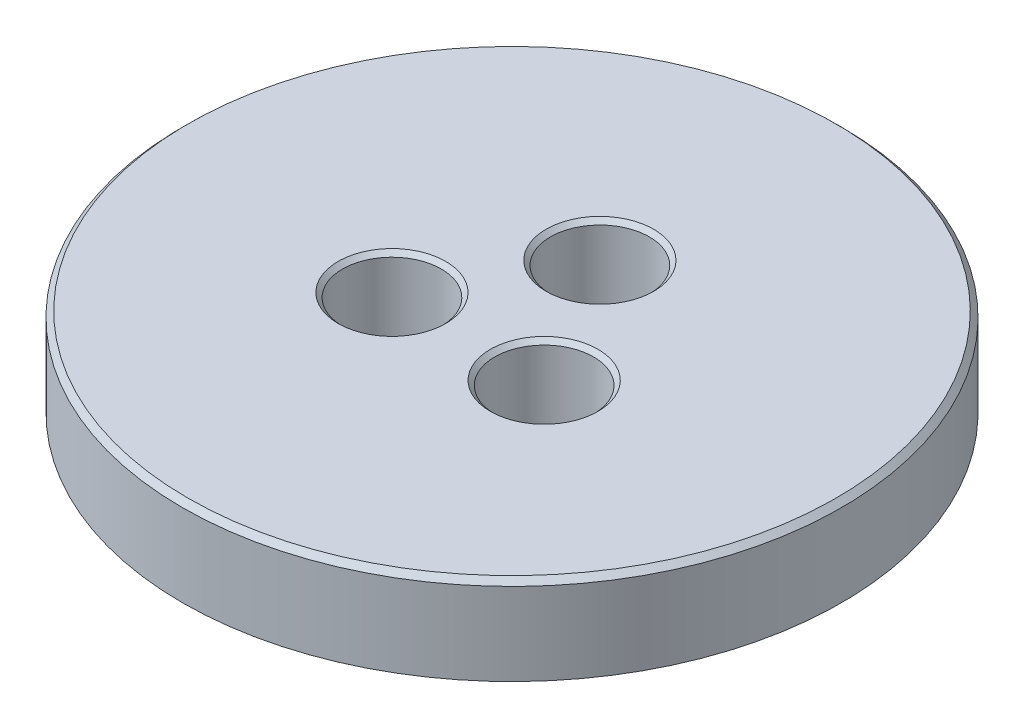
ISO-10303-21;
HEADER;
FILE_DESCRIPTION(('STEP AP214'),'2;1');
FILE_NAME('part.step','',(''),(''),'','','');
FILE_SCHEMA(('AUTOMOTIVE_DESIGN { 1 0 10303 214 1 1 1 1 }'));
ENDSEC;
DATA;
#1=APPLICATION_CONTEXT('core data for automotive mechanical design processes');
#2=APPLICATION_PROTOCOL_DEFINITION('international standard','automotive_design',2000,#1);
#3=PRODUCT_CONTEXT('',#1,'mechanical');
#4=PRODUCT('Part','Part','',(#3));
#5=PRODUCT_RELATED_PRODUCT_CATEGORY('part','',(#4));
#6=PRODUCT_DEFINITION_FORMATION('','',#4);
#7=PRODUCT_DEFINITION_CONTEXT('part definition',#1,'design');
#8=PRODUCT_DEFINITION('design','',#6,#7);
#9=PRODUCT_DEFINITION_SHAPE('','',#8);
#10=(LENGTH_UNIT() NAMED_UNIT(*) SI_UNIT(.MILLI.,.METRE.));
#11=(NAMED_UNIT(*) PLANE_ANGLE_UNIT() SI_UNIT($,.RADIAN.));
#12=(NAMED_UNIT(*) SI_UNIT($,.STERADIAN.) SOLID_ANGLE_UNIT());
#13=UNCERTAINTY_MEASURE_WITH_UNIT(LENGTH_MEASURE(1.E-05),#10,'distance_accuracy_value','');
#14=(GEOMETRIC_REPRESENTATION_CONTEXT(3) GLOBAL_UNCERTAINTY_ASSIGNED_CONTEXT((#13)) GLOBAL_UNIT_ASSIGNED_CONTEXT((#10,
#11,#12)) REPRESENTATION_CONTEXT('',''));
#15=CARTESIAN_POINT('',(0.,0.,0.));
#16=DIRECTION('',(0.,0.,1.));
#17=DIRECTION('',(1.,0.,0.));
#18=AXIS2_PLACEMENT_3D('',#15,#16,#17);
#19=CARTESIAN_POINT('',(0.,2.,0.));
#20=DIRECTION('',(0.,1.,0.));
#21=DIRECTION('',(0.,0.,1.));
#22=AXIS2_PLACEMENT_3D('',#19,#20,#21);
#23=PLANE('',#22);
#24=CARTESIAN_POINT('',(0.,2.,0.));
#25=DIRECTION('',(0.,1.,0.));
#26=DIRECTION('',(0.,0.,1.));
#27=AXIS2_PLACEMENT_3D('',#24,#25,#26);
#28=CIRCLE('',#27,7.375);
#29=CARTESIAN_POINT('',(0.,2.,7.375));
#30=VERTEX_POINT('',#29);
#31=EDGE_CURVE('E10',#30,#30,#28,.T.);
#32=ORIENTED_EDGE('',*,*,#31,.T.);
#33=EDGE_LOOP('',(#32));
#34=FACE_BOUND('',#33,.T.);
#35=CARTESIAN_POINT('',(1.73205080756888,2.,0.999999999999998));
#36=DIRECTION('',(0.,1.,0.));
#37=DIRECTION('',(0.,0.,1.));
#38=AXIS2_PLACEMENT_3D('',#35,#36,#37);
#39=CIRCLE('',#38,1.22500000000001);
#40=CARTESIAN_POINT('',(1.73205080756888,2.,2.225));
#41=VERTEX_POINT('',#40);
#42=EDGE_CURVE('E61',#41,#41,#39,.F.);
#43=ORIENTED_EDGE('',*,*,#42,.T.);
#44=EDGE_LOOP('',(#43));
#45=FACE_BOUND('',#44,.T.);
#46=CARTESIAN_POINT('',(-1.73205080756888,2.,0.999999999999996));
#47=DIRECTION('',(0.,1.,0.));
#48=DIRECTION('',(0.,0.,1.));
#49=AXIS2_PLACEMENT_3D('',#46,#47,#48);
#50=CIRCLE('',#49,1.22500000000001);
#51=CARTESIAN_POINT('',(-1.73205080756888,2.,2.225));
#52=VERTEX_POINT('',#51);
#53=EDGE_CURVE('E65',#52,#52,#50,.F.);
#54=ORIENTED_EDGE('',*,*,#53,.T.);
#55=EDGE_LOOP('',(#54));
#56=FACE_BOUND('',#55,.T.);
#57=CARTESIAN_POINT('',(0.,2.,-2.));
#58=DIRECTION('',(0.,1.,0.));
#59=DIRECTION('',(0.,0.,1.));
#60=AXIS2_PLACEMENT_3D('',#57,#58,#59);
#61=CIRCLE('',#60,1.22500000000001);
#62=CARTESIAN_POINT('',(0.,2.,-0.774999999999994));
#63=VERTEX_POINT('',#62);
#64=EDGE_CURVE('E68',#63,#63,#61,.F.);
#65=ORIENTED_EDGE('',*,*,#64,.T.);
#66=EDGE_LOOP('',(#65));
#67=FACE_BOUND('',#66,.T.);
#68=ADVANCED_FACE('F39',(#34,#45,#56,#67),#23,.T.);
#69=CARTESIAN_POINT('',(0.,0.,0.));
#70=DIRECTION('',(0.,-1.,0.));
#71=DIRECTION('',(0.,0.,-1.));
#72=AXIS2_PLACEMENT_3D('',#69,#70,#71);
#73=CYLINDRICAL_SURFACE('',#72,7.5);
#74=CARTESIAN_POINT('',(0.,1.875,0.));
#75=DIRECTION('',(0.,1.,0.));
#76=DIRECTION('',(0.,0.,1.));
#77=AXIS2_PLACEMENT_3D('',#74,#75,#76);
#78=CIRCLE('',#77,7.5);
#79=CARTESIAN_POINT('',(0.,1.875,7.5));
#80=VERTEX_POINT('',#79);
#81=EDGE_CURVE('E47',#80,#80,#78,.F.);
#82=ORIENTED_EDGE('',*,*,#81,.T.);
#83=EDGE_LOOP('',(#82));
#84=FACE_BOUND('',#83,.T.);
#85=CARTESIAN_POINT('',(0.,0.,0.));
#86=DIRECTION('',(0.,-1.,0.));
#87=DIRECTION('',(0.,0.,-1.));
#88=AXIS2_PLACEMENT_3D('',#85,#86,#87);
#89=CIRCLE('',#88,7.5);
#90=CARTESIAN_POINT('',(0.,0.,-7.5));
#91=VERTEX_POINT('',#90);
#92=EDGE_CURVE('E75',#91,#91,#89,.T.);
#93=ORIENTED_EDGE('',*,*,#92,.F.);
#94=EDGE_LOOP('',(#93));
#95=FACE_BOUND('',#94,.T.);
#96=ADVANCED_FACE('F109',(#84,#95),#73,.T.);
#97=CARTESIAN_POINT('',(0.,0.,0.));
#98=DIRECTION('',(0.,-1.,0.));
#99=DIRECTION('',(0.,0.,-1.));
#100=AXIS2_PLACEMENT_3D('',#97,#98,#99);
#101=PLANE('',#100);
#102=CARTESIAN_POINT('',(0.,0.,-2.));
#103=DIRECTION('',(0.,1.,0.));
#104=DIRECTION('',(0.,0.,1.));
#105=AXIS2_PLACEMENT_3D('',#102,#103,#104);
#106=CIRCLE('',#105,1.125);
#107=CARTESIAN_POINT('',(0.,0.,-0.875));
#108=VERTEX_POINT('',#107);
#109=EDGE_CURVE('E78',#108,#108,#106,.T.);
#110=ORIENTED_EDGE('',*,*,#109,.T.);
#111=EDGE_LOOP('',(#110));
#112=FACE_BOUND('',#111,.T.);
#113=CARTESIAN_POINT('',(-1.73205080756888,0.,0.999999999999996));
#114=DIRECTION('',(0.,1.,0.));
#115=DIRECTION('',(0.,0.,1.));
#116=AXIS2_PLACEMENT_3D('',#113,#114,#115);
#117=CIRCLE('',#116,1.125);
#118=CARTESIAN_POINT('',(-1.73205080756888,0.,2.125));
#119=VERTEX_POINT('',#118);
#120=EDGE_CURVE('E82',#119,#119,#117,.T.);
#121=ORIENTED_EDGE('',*,*,#120,.T.);
#122=EDGE_LOOP('',(#121));
#123=FACE_BOUND('',#122,.T.);
#124=CARTESIAN_POINT('',(1.73205080756888,0.,0.999999999999998));
#125=DIRECTION('',(0.,1.,0.));
#126=DIRECTION('',(0.,0.,1.));
#127=AXIS2_PLACEMENT_3D('',#124,#125,#126);
#128=CIRCLE('',#127,1.125);
#129=CARTESIAN_POINT('',(1.73205080756888,0.,2.125));
#130=VERTEX_POINT('',#129);
#131=EDGE_CURVE('E79',#130,#130,#128,.T.);
#132=ORIENTED_EDGE('',*,*,#131,.T.);
#133=EDGE_LOOP('',(#132));
#134=FACE_BOUND('',#133,.T.);
#135=ORIENTED_EDGE('',*,*,#92,.T.);
#136=EDGE_LOOP('',(#135));
#137=FACE_BOUND('',#136,.T.);
#138=ADVANCED_FACE('F89',(#112,#123,#134,#137),#101,.T.);
#139=CARTESIAN_POINT('',(1.73205080756888,2.,0.999999999999998));
#140=DIRECTION('',(0.,-1.,0.));
#141=DIRECTION('',(0.,0.,-1.));
#142=AXIS2_PLACEMENT_3D('',#139,#140,#141);
#143=CYLINDRICAL_SURFACE('',#142,1.125);
#144=CARTESIAN_POINT('',(1.73205080756888,1.9,0.999999999999998));
#145=DIRECTION('',(0.,1.,0.));
#146=DIRECTION('',(0.,0.,1.));
#147=AXIS2_PLACEMENT_3D('',#144,#145,#146);
#148=CIRCLE('',#147,1.125);
#149=CARTESIAN_POINT('',(1.73205080756888,1.9,2.125));
#150=VERTEX_POINT('',#149);
#151=EDGE_CURVE('E72',#150,#150,#148,.T.);
#152=ORIENTED_EDGE('',*,*,#151,.T.);
#153=EDGE_LOOP('',(#152));
#154=FACE_BOUND('',#153,.T.);
#155=ORIENTED_EDGE('',*,*,#131,.F.);
#156=EDGE_LOOP('',(#155));
#157=FACE_BOUND('',#156,.T.);
#158=ADVANCED_FACE('F105',(#154,#157),#143,.F.);
#159=CARTESIAN_POINT('',(-1.73205080756888,2.,0.999999999999996));
#160=DIRECTION('',(0.,-1.,0.));
#161=DIRECTION('',(0.,0.,-1.));
#162=AXIS2_PLACEMENT_3D('',#159,#160,#161);
#163=CYLINDRICAL_SURFACE('',#162,1.125);
#164=CARTESIAN_POINT('',(-1.73205080756888,1.9,0.999999999999996));
#165=DIRECTION('',(0.,1.,0.));
#166=DIRECTION('',(0.,0.,1.));
#167=AXIS2_PLACEMENT_3D('',#164,#165,#166);
#168=CIRCLE('',#167,1.125);
#169=CARTESIAN_POINT('',(-1.73205080756888,1.9,2.125));
#170=VERTEX_POINT('',#169);
#171=EDGE_CURVE('E56',#170,#170,#168,.T.);
#172=ORIENTED_EDGE('',*,*,#171,.T.);
#173=EDGE_LOOP('',(#172));
#174=FACE_BOUND('',#173,.T.);
#175=ORIENTED_EDGE('',*,*,#120,.F.);
#176=EDGE_LOOP('',(#175));
#177=FACE_BOUND('',#176,.T.);
#178=ADVANCED_FACE('F95',(#174,#177),#163,.F.);
#179=CARTESIAN_POINT('',(0.,2.,-2.));
#180=DIRECTION('',(0.,-1.,0.));
#181=DIRECTION('',(0.,0.,-1.));
#182=AXIS2_PLACEMENT_3D('',#179,#180,#181);
#183=CYLINDRICAL_SURFACE('',#182,1.125);
#184=CARTESIAN_POINT('',(0.,1.9,-2.));
#185=DIRECTION('',(0.,1.,0.));
#186=DIRECTION('',(0.,0.,1.));
#187=AXIS2_PLACEMENT_3D('',#184,#185,#186);
#188=CIRCLE('',#187,1.125);
#189=CARTESIAN_POINT('',(0.,1.9,-0.875));
#190=VERTEX_POINT('',#189);
#191=EDGE_CURVE('E51',#190,#190,#188,.T.);
#192=ORIENTED_EDGE('',*,*,#191,.T.);
#193=EDGE_LOOP('',(#192));
#194=FACE_BOUND('',#193,.T.);
#195=ORIENTED_EDGE('',*,*,#109,.F.);
#196=EDGE_LOOP('',(#195));
#197=FACE_BOUND('',#196,.T.);
#198=ADVANCED_FACE('F92',(#194,#197),#183,.F.);
#199=CARTESIAN_POINT('',(1.73205080756888,1.9,0.999999999999998));
#200=DIRECTION('',(0.,1.,0.));
#201=DIRECTION('',(0.,0.,1.));
#202=AXIS2_PLACEMENT_3D('',#199,#200,#201);
#203=CONICAL_SURFACE('',#202,1.125,0.785398163397461);
#204=ORIENTED_EDGE('',*,*,#42,.F.);
#205=EDGE_LOOP('',(#204));
#206=FACE_BOUND('',#205,.T.);
#207=ORIENTED_EDGE('',*,*,#151,.F.);
#208=EDGE_LOOP('',(#207));
#209=FACE_BOUND('',#208,.T.);
#210=ADVANCED_FACE('F94',(#206,#209),#203,.F.);
#211=CARTESIAN_POINT('',(-1.73205080756888,1.9,0.999999999999996));
#212=DIRECTION('',(0.,1.,0.));
#213=DIRECTION('',(0.,0.,1.));
#214=AXIS2_PLACEMENT_3D('',#211,#212,#213);
#215=CONICAL_SURFACE('',#214,1.125,0.785398163397461);
#216=ORIENTED_EDGE('',*,*,#53,.F.);
#217=EDGE_LOOP('',(#216));
#218=FACE_BOUND('',#217,.T.);
#219=ORIENTED_EDGE('',*,*,#171,.F.);
#220=EDGE_LOOP('',(#219));
#221=FACE_BOUND('',#220,.T.);
#222=ADVANCED_FACE('F102',(#218,#221),#215,.F.);
#223=CARTESIAN_POINT('',(0.,1.9,-2.));
#224=DIRECTION('',(0.,1.,0.));
#225=DIRECTION('',(0.,0.,1.));
#226=AXIS2_PLACEMENT_3D('',#223,#224,#225);
#227=CONICAL_SURFACE('',#226,1.125,0.785398163397461);
#228=ORIENTED_EDGE('',*,*,#64,.F.);
#229=EDGE_LOOP('',(#228));
#230=FACE_BOUND('',#229,.T.);
#231=ORIENTED_EDGE('',*,*,#191,.F.);
#232=EDGE_LOOP('',(#231));
#233=FACE_BOUND('',#232,.T.);
#234=ADVANCED_FACE('F126',(#230,#233),#227,.F.);
#235=CARTESIAN_POINT('',(0.,1.875,0.));
#236=DIRECTION('',(0.,-1.,0.));
#237=DIRECTION('',(0.,0.,-1.));
#238=AXIS2_PLACEMENT_3D('',#235,#236,#237);
#239=CONICAL_SURFACE('',#238,7.5,0.785398163397448);
#240=ORIENTED_EDGE('',*,*,#31,.F.);
#241=EDGE_LOOP('',(#240));
#242=FACE_BOUND('',#241,.T.);
#243=ORIENTED_EDGE('',*,*,#81,.F.);
#244=EDGE_LOOP('',(#243));
#245=FACE_BOUND('',#244,.T.);
#246=ADVANCED_FACE('F42',(#242,#245),#239,.T.);
#247=CLOSED_SHELL('',(#68,#96,#138,#158,#178,#198,#210,#222,#234,#246));
#248=MANIFOLD_SOLID_BREP('B2',#247);
#249=ADVANCED_BREP_SHAPE_REPRESENTATION('',(#18,#248),#14);
#250=SHAPE_DEFINITION_REPRESENTATION(#9,#249);
ENDSEC;
END-ISO-10303-21;
